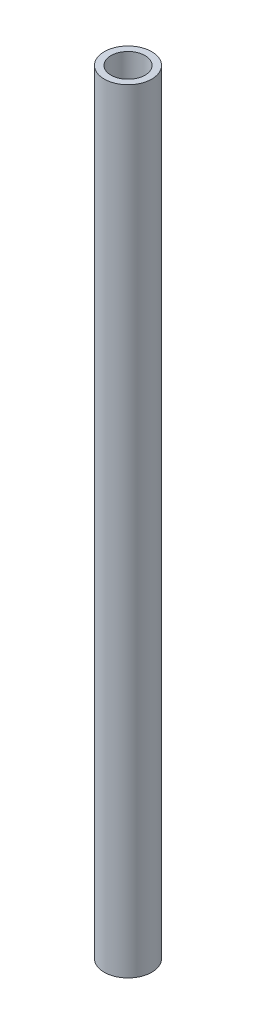
ISO-10303-21;
HEADER;
FILE_DESCRIPTION(('STEP AP214'),'2;1');
FILE_NAME('part.step','',(''),(''),'','','');
FILE_SCHEMA(('AUTOMOTIVE_DESIGN { 1 0 10303 214 1 1 1 1 }'));
ENDSEC;
DATA;
#1=APPLICATION_CONTEXT('core data for automotive mechanical design processes');
#2=APPLICATION_PROTOCOL_DEFINITION('international standard','automotive_design',2000,#1);
#3=PRODUCT_CONTEXT('',#1,'mechanical');
#4=PRODUCT('Part','Part','',(#3));
#5=PRODUCT_RELATED_PRODUCT_CATEGORY('part','',(#4));
#6=PRODUCT_DEFINITION_FORMATION('','',#4);
#7=PRODUCT_DEFINITION_CONTEXT('part definition',#1,'design');
#8=PRODUCT_DEFINITION('design','',#6,#7);
#9=PRODUCT_DEFINITION_SHAPE('','',#8);
#10=(LENGTH_UNIT() NAMED_UNIT(*) SI_UNIT(.MILLI.,.METRE.));
#11=(NAMED_UNIT(*) PLANE_ANGLE_UNIT() SI_UNIT($,.RADIAN.));
#12=(NAMED_UNIT(*) SI_UNIT($,.STERADIAN.) SOLID_ANGLE_UNIT());
#13=UNCERTAINTY_MEASURE_WITH_UNIT(LENGTH_MEASURE(1.E-05),#10,'distance_accuracy_value','');
#14=(GEOMETRIC_REPRESENTATION_CONTEXT(3) GLOBAL_UNCERTAINTY_ASSIGNED_CONTEXT((#13)) GLOBAL_UNIT_ASSIGNED_CONTEXT((#10,
#11,#12)) REPRESENTATION_CONTEXT('',''));
#15=CARTESIAN_POINT('',(0.,0.,0.));
#16=DIRECTION('',(0.,0.,1.));
#17=DIRECTION('',(1.,0.,0.));
#18=AXIS2_PLACEMENT_3D('',#15,#16,#17);
#19=CARTESIAN_POINT('',(0.,280.,0.));
#20=DIRECTION('',(0.,1.,0.));
#21=DIRECTION('',(0.,0.,1.));
#22=AXIS2_PLACEMENT_3D('',#19,#20,#21);
#23=PLANE('',#22);
#24=CARTESIAN_POINT('',(-2.40771245623309E-13,280.,-1.22819696082343E-13));
#25=DIRECTION('',(0.,1.,0.));
#26=DIRECTION('',(0.,0.,1.));
#27=AXIS2_PLACEMENT_3D('',#24,#25,#26);
#28=CIRCLE('',#27,12.55);
#29=CARTESIAN_POINT('',(-2.40771245623309E-13,280.,12.5499999999999));
#30=VERTEX_POINT('',#29);
#31=EDGE_CURVE('E51',#30,#30,#28,.T.);
#32=ORIENTED_EDGE('',*,*,#31,.F.);
#33=EDGE_LOOP('',(#32));
#34=FACE_BOUND('',#33,.T.);
#35=CARTESIAN_POINT('',(0.,280.,0.));
#36=DIRECTION('',(0.,1.,0.));
#37=DIRECTION('',(0.,0.,1.));
#38=AXIS2_PLACEMENT_3D('',#35,#36,#37);
#39=CIRCLE('',#38,17.5);
#40=CARTESIAN_POINT('',(0.,280.,17.5));
#41=VERTEX_POINT('',#40);
#42=EDGE_CURVE('E10',#41,#41,#39,.T.);
#43=ORIENTED_EDGE('',*,*,#42,.T.);
#44=EDGE_LOOP('',(#43));
#45=FACE_BOUND('',#44,.T.);
#46=ADVANCED_FACE('F39',(#34,#45),#23,.T.);
#47=CARTESIAN_POINT('',(0.,280.,0.));
#48=DIRECTION('',(0.,-1.,0.));
#49=DIRECTION('',(0.,0.,-1.));
#50=AXIS2_PLACEMENT_3D('',#47,#48,#49);
#51=CYLINDRICAL_SURFACE('',#50,17.5);
#52=ORIENTED_EDGE('',*,*,#42,.F.);
#53=EDGE_LOOP('',(#52));
#54=FACE_BOUND('',#53,.T.);
#55=CARTESIAN_POINT('',(0.,-290.,0.));
#56=DIRECTION('',(0.,-1.,0.));
#57=DIRECTION('',(0.,0.,-1.));
#58=AXIS2_PLACEMENT_3D('',#55,#56,#57);
#59=CIRCLE('',#58,17.5);
#60=CARTESIAN_POINT('',(0.,-290.,-17.5));
#61=VERTEX_POINT('',#60);
#62=EDGE_CURVE('E47',#61,#61,#59,.T.);
#63=ORIENTED_EDGE('',*,*,#62,.F.);
#64=EDGE_LOOP('',(#63));
#65=FACE_BOUND('',#64,.T.);
#66=ADVANCED_FACE('F41',(#54,#65),#51,.T.);
#67=CARTESIAN_POINT('',(0.,-290.,0.));
#68=DIRECTION('',(0.,-1.,0.));
#69=DIRECTION('',(0.,0.,-1.));
#70=AXIS2_PLACEMENT_3D('',#67,#68,#69);
#71=PLANE('',#70);
#72=CARTESIAN_POINT('',(-1.73989262574208E-13,-290.,-1.43139318073826E-13));
#73=DIRECTION('',(0.,-1.,0.));
#74=DIRECTION('',(0.,0.,-1.));
#75=AXIS2_PLACEMENT_3D('',#72,#73,#74);
#76=CIRCLE('',#75,12.55);
#77=CARTESIAN_POINT('',(-1.73989262574208E-13,-290.,-12.5500000000001));
#78=VERTEX_POINT('',#77);
#79=EDGE_CURVE('E43',#78,#78,#76,.T.);
#80=ORIENTED_EDGE('',*,*,#79,.F.);
#81=EDGE_LOOP('',(#80));
#82=FACE_BOUND('',#81,.T.);
#83=ORIENTED_EDGE('',*,*,#62,.T.);
#84=EDGE_LOOP('',(#83));
#85=FACE_BOUND('',#84,.T.);
#86=ADVANCED_FACE('F62',(#82,#85),#71,.T.);
#87=CARTESIAN_POINT('',(-1.51352418738135E-13,-483.21080922492,-1.50026985807368E-13));
#88=DIRECTION('',(0.,1.,0.));
#89=DIRECTION('',(-1.,0.,0.));
#90=AXIS2_PLACEMENT_3D('',#87,#88,#89);
#91=CYLINDRICAL_SURFACE('',#90,12.55);
#92=ORIENTED_EDGE('',*,*,#31,.T.);
#93=EDGE_LOOP('',(#92));
#94=FACE_BOUND('',#93,.T.);
#95=ORIENTED_EDGE('',*,*,#79,.T.);
#96=EDGE_LOOP('',(#95));
#97=FACE_BOUND('',#96,.T.);
#98=ADVANCED_FACE('F60',(#94,#97),#91,.F.);
#99=CLOSED_SHELL('',(#46,#66,#86,#98));
#100=MANIFOLD_SOLID_BREP('B2',#99);
#101=ADVANCED_BREP_SHAPE_REPRESENTATION('',(#18,#100),#14);
#102=SHAPE_DEFINITION_REPRESENTATION(#9,#101);
ENDSEC;
END-ISO-10303-21;
